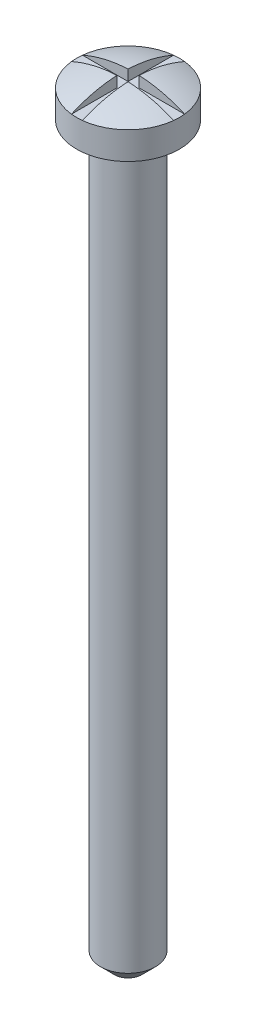
ISO-10303-21;
HEADER;
FILE_DESCRIPTION(('STEP AP214'),'2;1');
FILE_NAME('part.step','',(''),(''),'','','');
FILE_SCHEMA(('AUTOMOTIVE_DESIGN { 1 0 10303 214 1 1 1 1 }'));
ENDSEC;
DATA;
#1=APPLICATION_CONTEXT('core data for automotive mechanical design processes');
#2=APPLICATION_PROTOCOL_DEFINITION('international standard','automotive_design',2000,#1);
#3=PRODUCT_CONTEXT('',#1,'mechanical');
#4=PRODUCT('Part','Part','',(#3));
#5=PRODUCT_RELATED_PRODUCT_CATEGORY('part','',(#4));
#6=PRODUCT_DEFINITION_FORMATION('','',#4);
#7=PRODUCT_DEFINITION_CONTEXT('part definition',#1,'design');
#8=PRODUCT_DEFINITION('design','',#6,#7);
#9=PRODUCT_DEFINITION_SHAPE('','',#8);
#10=(LENGTH_UNIT() NAMED_UNIT(*) SI_UNIT(.MILLI.,.METRE.));
#11=(NAMED_UNIT(*) PLANE_ANGLE_UNIT() SI_UNIT($,.RADIAN.));
#12=(NAMED_UNIT(*) SI_UNIT($,.STERADIAN.) SOLID_ANGLE_UNIT());
#13=UNCERTAINTY_MEASURE_WITH_UNIT(LENGTH_MEASURE(1.E-05),#10,'distance_accuracy_value','');
#14=(GEOMETRIC_REPRESENTATION_CONTEXT(3) GLOBAL_UNCERTAINTY_ASSIGNED_CONTEXT((#13)) GLOBAL_UNIT_ASSIGNED_CONTEXT((#10,
#11,#12)) REPRESENTATION_CONTEXT('',''));
#15=CARTESIAN_POINT('',(0.,0.,0.));
#16=DIRECTION('',(0.,0.,1.));
#17=DIRECTION('',(1.,0.,0.));
#18=AXIS2_PLACEMENT_3D('',#15,#16,#17);
#19=CARTESIAN_POINT('',(0.,35.2666666666666,0.));
#20=DIRECTION('',(0.,-1.,0.));
#21=DIRECTION('',(-1.,0.,0.));
#22=AXIS2_PLACEMENT_3D('',#19,#20,#21);
#23=SPHERICAL_SURFACE('',#22,6.83333333333337);
#24=CARTESIAN_POINT('',(-0.300000000000007,35.2666666666666,0.));
#25=DIRECTION('',(1.,0.,0.));
#26=DIRECTION('',(0.,1.,0.));
#27=AXIS2_PLACEMENT_3D('',#24,#25,#26);
#28=CIRCLE('',#27,6.82674479121968);
#29=CARTESIAN_POINT('',(-0.300000000000008,42.086816550976,0.3));
#30=VERTEX_POINT('',#29);
#31=CARTESIAN_POINT('',(-0.300000000000008,41.5,2.783882181415));
#32=VERTEX_POINT('',#31);
#33=EDGE_CURVE('E104',#30,#32,#28,.T.);
#34=ORIENTED_EDGE('',*,*,#33,.F.);
#35=CARTESIAN_POINT('',(0.,35.2666666666666,0.3));
#36=DIRECTION('',(0.,0.,1.));
#37=DIRECTION('',(1.,0.,0.));
#38=AXIS2_PLACEMENT_3D('',#35,#36,#37);
#39=CIRCLE('',#38,6.82674479121968);
#40=CARTESIAN_POINT('',(-2.78388218141501,41.5,0.3));
#41=VERTEX_POINT('',#40);
#42=EDGE_CURVE('E55',#30,#41,#39,.T.);
#43=ORIENTED_EDGE('',*,*,#42,.T.);
#44=CARTESIAN_POINT('',(0.,41.5,0.));
#45=DIRECTION('',(0.,-1.,0.));
#46=DIRECTION('',(1.,0.,0.));
#47=AXIS2_PLACEMENT_3D('',#44,#45,#46);
#48=CIRCLE('',#47,2.79999999999999);
#49=EDGE_CURVE('E160',#32,#41,#48,.T.);
#50=ORIENTED_EDGE('',*,*,#49,.F.);
#51=EDGE_LOOP('',(#34,#43,#50));
#52=FACE_BOUND('',#51,.T.);
#53=ADVANCED_FACE('F32',(#52),#23,.T.);
#54=CARTESIAN_POINT('',(0.,35.2666666666666,-0.3));
#55=DIRECTION('',(0.,0.,1.));
#56=DIRECTION('',(1.,0.,0.));
#57=AXIS2_PLACEMENT_3D('',#54,#55,#56);
#58=CIRCLE('',#57,6.82674479121968);
#59=CARTESIAN_POINT('',(-0.300000000000008,42.086816550976,-0.3));
#60=VERTEX_POINT('',#59);
#61=CARTESIAN_POINT('',(-2.78388218141501,41.5,-0.3));
#62=VERTEX_POINT('',#61);
#63=EDGE_CURVE('E173',#60,#62,#58,.T.);
#64=ORIENTED_EDGE('',*,*,#63,.F.);
#65=CARTESIAN_POINT('',(-0.300000000000007,35.2666666666666,0.));
#66=DIRECTION('',(1.,0.,0.));
#67=DIRECTION('',(0.,1.,0.));
#68=AXIS2_PLACEMENT_3D('',#65,#66,#67);
#69=CIRCLE('',#68,6.82674479121968);
#70=CARTESIAN_POINT('',(-0.300000000000008,41.5,-2.783882181415));
#71=VERTEX_POINT('',#70);
#72=EDGE_CURVE('E171',#71,#60,#69,.T.);
#73=ORIENTED_EDGE('',*,*,#72,.F.);
#74=EDGE_CURVE('E387',#62,#71,#48,.T.);
#75=ORIENTED_EDGE('',*,*,#74,.F.);
#76=EDGE_LOOP('',(#64,#73,#75));
#77=FACE_BOUND('',#76,.T.);
#78=ADVANCED_FACE('F190',(#77),#23,.T.);
#79=CARTESIAN_POINT('',(0.299999999999992,41.5,-2.783882181415));
#80=VERTEX_POINT('',#79);
#81=CARTESIAN_POINT('',(2.78388218141499,41.5,-0.3));
#82=VERTEX_POINT('',#81);
#83=EDGE_CURVE('E155',#80,#82,#48,.T.);
#84=ORIENTED_EDGE('',*,*,#83,.F.);
#85=CARTESIAN_POINT('',(0.299999999999993,35.2666666666666,0.));
#86=DIRECTION('',(1.,0.,0.));
#87=DIRECTION('',(0.,1.,0.));
#88=AXIS2_PLACEMENT_3D('',#85,#86,#87);
#89=CIRCLE('',#88,6.82674479121968);
#90=CARTESIAN_POINT('',(0.299999999999991,42.086816550976,-0.3));
#91=VERTEX_POINT('',#90);
#92=EDGE_CURVE('E168',#80,#91,#89,.T.);
#93=ORIENTED_EDGE('',*,*,#92,.T.);
#94=CARTESIAN_POINT('',(0.,35.2666666666666,-0.3));
#95=DIRECTION('',(0.,0.,1.));
#96=DIRECTION('',(1.,0.,0.));
#97=AXIS2_PLACEMENT_3D('',#94,#95,#96);
#98=CIRCLE('',#97,6.82674479121968);
#99=EDGE_CURVE('E166',#82,#91,#98,.T.);
#100=ORIENTED_EDGE('',*,*,#99,.F.);
#101=EDGE_LOOP('',(#84,#93,#100));
#102=FACE_BOUND('',#101,.T.);
#103=ADVANCED_FACE('F196',(#102),#23,.T.);
#104=CARTESIAN_POINT('',(2.78388218141499,41.5,0.3));
#105=VERTEX_POINT('',#104);
#106=CARTESIAN_POINT('',(0.299999999999992,41.5,2.783882181415));
#107=VERTEX_POINT('',#106);
#108=EDGE_CURVE('E156',#105,#107,#48,.T.);
#109=ORIENTED_EDGE('',*,*,#108,.F.);
#110=CARTESIAN_POINT('',(0.,35.2666666666666,0.3));
#111=DIRECTION('',(0.,0.,1.));
#112=DIRECTION('',(1.,0.,0.));
#113=AXIS2_PLACEMENT_3D('',#110,#111,#112);
#114=CIRCLE('',#113,6.82674479121968);
#115=CARTESIAN_POINT('',(0.299999999999991,42.086816550976,0.3));
#116=VERTEX_POINT('',#115);
#117=EDGE_CURVE('E163',#105,#116,#114,.T.);
#118=ORIENTED_EDGE('',*,*,#117,.T.);
#119=CARTESIAN_POINT('',(0.299999999999993,35.2666666666666,0.));
#120=DIRECTION('',(1.,0.,0.));
#121=DIRECTION('',(0.,1.,0.));
#122=AXIS2_PLACEMENT_3D('',#119,#120,#121);
#123=CIRCLE('',#122,6.82674479121968);
#124=EDGE_CURVE('E159',#116,#107,#123,.T.);
#125=ORIENTED_EDGE('',*,*,#124,.T.);
#126=EDGE_LOOP('',(#109,#118,#125));
#127=FACE_BOUND('',#126,.T.);
#128=ADVANCED_FACE('F192',(#127),#23,.T.);
#129=CARTESIAN_POINT('',(0.,0.,0.));
#130=DIRECTION('',(0.,-1.,0.));
#131=DIRECTION('',(1.,0.,0.));
#132=AXIS2_PLACEMENT_3D('',#129,#130,#131);
#133=CYLINDRICAL_SURFACE('',#132,2.79999999999999);
#134=CARTESIAN_POINT('',(0.,40.,0.));
#135=DIRECTION('',(0.,-1.,0.));
#136=DIRECTION('',(1.,0.,0.));
#137=AXIS2_PLACEMENT_3D('',#134,#135,#136);
#138=CIRCLE('',#137,2.79999999999999);
#139=CARTESIAN_POINT('',(2.79999999999998,40.,0.));
#140=VERTEX_POINT('',#139);
#141=EDGE_CURVE('E152',#140,#140,#138,.T.);
#142=ORIENTED_EDGE('',*,*,#141,.F.);
#143=EDGE_LOOP('',(#142));
#144=FACE_BOUND('',#143,.T.);
#145=ORIENTED_EDGE('',*,*,#108,.T.);
#146=CARTESIAN_POINT('',(0.,41.5,0.));
#147=DIRECTION('',(0.,-1.,0.));
#148=DIRECTION('',(0.,0.,-1.));
#149=AXIS2_PLACEMENT_3D('',#146,#147,#148);
#150=CIRCLE('',#149,2.79999999999999);
#151=EDGE_CURVE('E139',#107,#32,#150,.T.);
#152=ORIENTED_EDGE('',*,*,#151,.T.);
#153=ORIENTED_EDGE('',*,*,#49,.T.);
#154=CARTESIAN_POINT('',(0.,41.5,0.));
#155=DIRECTION('',(0.,-1.,0.));
#156=DIRECTION('',(0.,0.,-1.));
#157=AXIS2_PLACEMENT_3D('',#154,#155,#156);
#158=CIRCLE('',#157,2.79999999999999);
#159=EDGE_CURVE('E116',#41,#62,#158,.T.);
#160=ORIENTED_EDGE('',*,*,#159,.T.);
#161=ORIENTED_EDGE('',*,*,#74,.T.);
#162=CARTESIAN_POINT('',(0.,41.5,0.));
#163=DIRECTION('',(0.,-1.,0.));
#164=DIRECTION('',(0.,0.,-1.));
#165=AXIS2_PLACEMENT_3D('',#162,#163,#164);
#166=CIRCLE('',#165,2.79999999999999);
#167=EDGE_CURVE('E124',#71,#80,#166,.T.);
#168=ORIENTED_EDGE('',*,*,#167,.T.);
#169=ORIENTED_EDGE('',*,*,#83,.T.);
#170=CARTESIAN_POINT('',(0.,41.5,0.));
#171=DIRECTION('',(0.,-1.,0.));
#172=DIRECTION('',(0.,0.,-1.));
#173=AXIS2_PLACEMENT_3D('',#170,#171,#172);
#174=CIRCLE('',#173,2.79999999999999);
#175=EDGE_CURVE('E130',#82,#105,#174,.T.);
#176=ORIENTED_EDGE('',*,*,#175,.T.);
#177=EDGE_LOOP('',(#145,#152,#153,#160,#161,#168,#169,#176));
#178=FACE_BOUND('',#177,.T.);
#179=ADVANCED_FACE('F200',(#144,#178),#133,.T.);
#180=CARTESIAN_POINT('',(-1.5,40.,0.));
#181=DIRECTION('',(0.,1.,0.));
#182=DIRECTION('',(-1.,0.,0.));
#183=AXIS2_PLACEMENT_3D('',#180,#181,#182);
#184=PLANE('',#183);
#185=CARTESIAN_POINT('',(0.,40.,0.));
#186=DIRECTION('',(0.,-1.,0.));
#187=DIRECTION('',(1.,0.,0.));
#188=AXIS2_PLACEMENT_3D('',#185,#186,#187);
#189=CIRCLE('',#188,1.49999999999999);
#190=CARTESIAN_POINT('',(1.49999999999998,40.,0.));
#191=VERTEX_POINT('',#190);
#192=EDGE_CURVE('E110',#191,#191,#189,.T.);
#193=ORIENTED_EDGE('',*,*,#192,.F.);
#194=EDGE_LOOP('',(#193));
#195=FACE_BOUND('',#194,.T.);
#196=ORIENTED_EDGE('',*,*,#141,.T.);
#197=EDGE_LOOP('',(#196));
#198=FACE_BOUND('',#197,.T.);
#199=ADVANCED_FACE('F206',(#195,#198),#184,.F.);
#200=CARTESIAN_POINT('',(0.,0.,0.));
#201=DIRECTION('',(0.,-1.,0.));
#202=DIRECTION('',(1.,0.,0.));
#203=AXIS2_PLACEMENT_3D('',#200,#201,#202);
#204=CYLINDRICAL_SURFACE('',#203,1.5);
#205=CARTESIAN_POINT('',(0.,0.750000000000011,0.));
#206=DIRECTION('',(0.,1.,0.));
#207=DIRECTION('',(-1.,0.,0.));
#208=AXIS2_PLACEMENT_3D('',#205,#206,#207);
#209=CIRCLE('',#208,1.5);
#210=CARTESIAN_POINT('',(-1.5,0.75000000000001,0.));
#211=VERTEX_POINT('',#210);
#212=EDGE_CURVE('E11',#211,#211,#209,.T.);
#213=ORIENTED_EDGE('',*,*,#212,.T.);
#214=EDGE_LOOP('',(#213));
#215=FACE_BOUND('',#214,.T.);
#216=ORIENTED_EDGE('',*,*,#192,.T.);
#217=EDGE_LOOP('',(#216));
#218=FACE_BOUND('',#217,.T.);
#219=ADVANCED_FACE('F244',(#215,#218),#204,.T.);
#220=CARTESIAN_POINT('',(0.,0.,0.));
#221=DIRECTION('',(0.,1.,0.));
#222=DIRECTION('',(-1.,0.,0.));
#223=AXIS2_PLACEMENT_3D('',#220,#221,#222);
#224=PLANE('',#223);
#225=CARTESIAN_POINT('',(0.,0.,0.));
#226=DIRECTION('',(0.,1.,0.));
#227=DIRECTION('',(-1.,0.,0.));
#228=AXIS2_PLACEMENT_3D('',#225,#226,#227);
#229=CIRCLE('',#228,0.749999999999987);
#230=CARTESIAN_POINT('',(-0.749999999999987,0.,0.));
#231=VERTEX_POINT('',#230);
#232=EDGE_CURVE('E40',#231,#231,#229,.F.);
#233=ORIENTED_EDGE('',*,*,#232,.T.);
#234=EDGE_LOOP('',(#233));
#235=FACE_BOUND('',#234,.T.);
#236=ADVANCED_FACE('F179',(#235),#224,.F.);
#237=CARTESIAN_POINT('',(-0.300000000000008,41.5,0.));
#238=DIRECTION('',(1.,0.,0.));
#239=DIRECTION('',(0.,1.,0.));
#240=AXIS2_PLACEMENT_3D('',#237,#238,#239);
#241=PLANE('',#240);
#242=ORIENTED_EDGE('',*,*,#33,.T.);
#243=DIRECTION('',(0.,0.,-1.));
#244=VECTOR('',#243,1.);
#245=CARTESIAN_POINT('',(-0.300000000000008,41.5,0.));
#246=LINE('',#245,#244);
#247=CARTESIAN_POINT('',(-0.300000000000008,41.5,0.3));
#248=VERTEX_POINT('',#247);
#249=EDGE_CURVE('E100',#32,#248,#246,.T.);
#250=ORIENTED_EDGE('',*,*,#249,.T.);
#251=DIRECTION('',(0.,1.,0.));
#252=VECTOR('',#251,1.);
#253=CARTESIAN_POINT('',(-0.300000000000008,41.5,0.3));
#254=LINE('',#253,#252);
#255=EDGE_CURVE('E102',#248,#30,#254,.T.);
#256=ORIENTED_EDGE('',*,*,#255,.T.);
#257=EDGE_LOOP('',(#242,#250,#256));
#258=FACE_BOUND('',#257,.T.);
#259=ADVANCED_FACE('F101',(#258),#241,.T.);
#260=CARTESIAN_POINT('',(0.,41.5,0.3));
#261=DIRECTION('',(0.,0.,1.));
#262=DIRECTION('',(1.,0.,0.));
#263=AXIS2_PLACEMENT_3D('',#260,#261,#262);
#264=PLANE('',#263);
#265=ORIENTED_EDGE('',*,*,#255,.F.);
#266=DIRECTION('',(1.,0.,0.));
#267=VECTOR('',#266,1.);
#268=CARTESIAN_POINT('',(0.,41.5,0.3));
#269=LINE('',#268,#267);
#270=EDGE_CURVE('E107',#41,#248,#269,.T.);
#271=ORIENTED_EDGE('',*,*,#270,.F.);
#272=ORIENTED_EDGE('',*,*,#42,.F.);
#273=EDGE_LOOP('',(#265,#271,#272));
#274=FACE_BOUND('',#273,.T.);
#275=ADVANCED_FACE('F109',(#274),#264,.F.);
#276=CARTESIAN_POINT('',(0.,41.5,-0.3));
#277=DIRECTION('',(0.,0.,1.));
#278=DIRECTION('',(1.,0.,0.));
#279=AXIS2_PLACEMENT_3D('',#276,#277,#278);
#280=PLANE('',#279);
#281=ORIENTED_EDGE('',*,*,#63,.T.);
#282=DIRECTION('',(1.,0.,0.));
#283=VECTOR('',#282,1.);
#284=CARTESIAN_POINT('',(0.,41.5,-0.3));
#285=LINE('',#284,#283);
#286=CARTESIAN_POINT('',(-0.300000000000008,41.5,-0.3));
#287=VERTEX_POINT('',#286);
#288=EDGE_CURVE('E118',#62,#287,#285,.T.);
#289=ORIENTED_EDGE('',*,*,#288,.T.);
#290=DIRECTION('',(0.,1.,0.));
#291=VECTOR('',#290,1.);
#292=CARTESIAN_POINT('',(-0.300000000000008,41.5,-0.3));
#293=LINE('',#292,#291);
#294=EDGE_CURVE('E111',#287,#60,#293,.T.);
#295=ORIENTED_EDGE('',*,*,#294,.T.);
#296=EDGE_LOOP('',(#281,#289,#295));
#297=FACE_BOUND('',#296,.T.);
#298=ADVANCED_FACE('F230',(#297),#280,.T.);
#299=CARTESIAN_POINT('',(-0.300000000000008,41.5,0.));
#300=DIRECTION('',(1.,0.,0.));
#301=DIRECTION('',(0.,1.,0.));
#302=AXIS2_PLACEMENT_3D('',#299,#300,#301);
#303=PLANE('',#302);
#304=ORIENTED_EDGE('',*,*,#72,.T.);
#305=ORIENTED_EDGE('',*,*,#294,.F.);
#306=DIRECTION('',(0.,0.,-1.));
#307=VECTOR('',#306,1.);
#308=CARTESIAN_POINT('',(-0.300000000000008,41.5,0.));
#309=LINE('',#308,#307);
#310=EDGE_CURVE('E122',#287,#71,#309,.T.);
#311=ORIENTED_EDGE('',*,*,#310,.T.);
#312=EDGE_LOOP('',(#304,#305,#311));
#313=FACE_BOUND('',#312,.T.);
#314=ADVANCED_FACE('F222',(#313),#303,.T.);
#315=CARTESIAN_POINT('',(0.299999999999992,41.5,0.));
#316=DIRECTION('',(1.,0.,0.));
#317=DIRECTION('',(0.,1.,0.));
#318=AXIS2_PLACEMENT_3D('',#315,#316,#317);
#319=PLANE('',#318);
#320=DIRECTION('',(0.,0.,-1.));
#321=VECTOR('',#320,1.);
#322=CARTESIAN_POINT('',(0.299999999999992,41.5,0.));
#323=LINE('',#322,#321);
#324=CARTESIAN_POINT('',(0.299999999999992,41.5,-0.3));
#325=VERTEX_POINT('',#324);
#326=EDGE_CURVE('E47',#325,#80,#323,.T.);
#327=ORIENTED_EDGE('',*,*,#326,.F.);
#328=DIRECTION('',(0.,1.,0.));
#329=VECTOR('',#328,1.);
#330=CARTESIAN_POINT('',(0.299999999999992,41.5,-0.3));
#331=LINE('',#330,#329);
#332=EDGE_CURVE('E145',#325,#91,#331,.T.);
#333=ORIENTED_EDGE('',*,*,#332,.T.);
#334=ORIENTED_EDGE('',*,*,#92,.F.);
#335=EDGE_LOOP('',(#327,#333,#334));
#336=FACE_BOUND('',#335,.T.);
#337=ADVANCED_FACE('F220',(#336),#319,.F.);
#338=CARTESIAN_POINT('',(0.,41.5,-0.3));
#339=DIRECTION('',(0.,0.,1.));
#340=DIRECTION('',(1.,0.,0.));
#341=AXIS2_PLACEMENT_3D('',#338,#339,#340);
#342=PLANE('',#341);
#343=ORIENTED_EDGE('',*,*,#99,.T.);
#344=ORIENTED_EDGE('',*,*,#332,.F.);
#345=DIRECTION('',(1.,0.,0.));
#346=VECTOR('',#345,1.);
#347=CARTESIAN_POINT('',(0.,41.5,-0.3));
#348=LINE('',#347,#346);
#349=EDGE_CURVE('E128',#325,#82,#348,.T.);
#350=ORIENTED_EDGE('',*,*,#349,.T.);
#351=EDGE_LOOP('',(#343,#344,#350));
#352=FACE_BOUND('',#351,.T.);
#353=ADVANCED_FACE('F218',(#352),#342,.T.);
#354=CARTESIAN_POINT('',(0.,41.5,0.3));
#355=DIRECTION('',(0.,0.,1.));
#356=DIRECTION('',(1.,0.,0.));
#357=AXIS2_PLACEMENT_3D('',#354,#355,#356);
#358=PLANE('',#357);
#359=DIRECTION('',(1.,0.,0.));
#360=VECTOR('',#359,1.);
#361=CARTESIAN_POINT('',(0.,41.5,0.3));
#362=LINE('',#361,#360);
#363=CARTESIAN_POINT('',(0.299999999999992,41.5,0.3));
#364=VERTEX_POINT('',#363);
#365=EDGE_CURVE('E133',#364,#105,#362,.T.);
#366=ORIENTED_EDGE('',*,*,#365,.F.);
#367=DIRECTION('',(0.,1.,0.));
#368=VECTOR('',#367,1.);
#369=CARTESIAN_POINT('',(0.299999999999992,41.5,0.3));
#370=LINE('',#369,#368);
#371=EDGE_CURVE('E142',#364,#116,#370,.T.);
#372=ORIENTED_EDGE('',*,*,#371,.T.);
#373=ORIENTED_EDGE('',*,*,#117,.F.);
#374=EDGE_LOOP('',(#366,#372,#373));
#375=FACE_BOUND('',#374,.T.);
#376=ADVANCED_FACE('F228',(#375),#358,.F.);
#377=CARTESIAN_POINT('',(0.299999999999992,41.5,0.));
#378=DIRECTION('',(1.,0.,0.));
#379=DIRECTION('',(0.,1.,0.));
#380=AXIS2_PLACEMENT_3D('',#377,#378,#379);
#381=PLANE('',#380);
#382=ORIENTED_EDGE('',*,*,#371,.F.);
#383=DIRECTION('',(0.,0.,-1.));
#384=VECTOR('',#383,1.);
#385=CARTESIAN_POINT('',(0.299999999999992,41.5,0.));
#386=LINE('',#385,#384);
#387=EDGE_CURVE('E136',#107,#364,#386,.T.);
#388=ORIENTED_EDGE('',*,*,#387,.F.);
#389=ORIENTED_EDGE('',*,*,#124,.F.);
#390=EDGE_LOOP('',(#382,#388,#389));
#391=FACE_BOUND('',#390,.T.);
#392=ADVANCED_FACE('F186',(#391),#381,.F.);
#393=CARTESIAN_POINT('',(0.,41.5,0.));
#394=DIRECTION('',(0.,-1.,0.));
#395=DIRECTION('',(0.,0.,-1.));
#396=AXIS2_PLACEMENT_3D('',#393,#394,#395);
#397=PLANE('',#396);
#398=ORIENTED_EDGE('',*,*,#249,.F.);
#399=ORIENTED_EDGE('',*,*,#151,.F.);
#400=ORIENTED_EDGE('',*,*,#387,.T.);
#401=ORIENTED_EDGE('',*,*,#365,.T.);
#402=ORIENTED_EDGE('',*,*,#175,.F.);
#403=ORIENTED_EDGE('',*,*,#349,.F.);
#404=ORIENTED_EDGE('',*,*,#326,.T.);
#405=ORIENTED_EDGE('',*,*,#167,.F.);
#406=ORIENTED_EDGE('',*,*,#310,.F.);
#407=ORIENTED_EDGE('',*,*,#288,.F.);
#408=ORIENTED_EDGE('',*,*,#159,.F.);
#409=ORIENTED_EDGE('',*,*,#270,.T.);
#410=EDGE_LOOP('',(#398,#399,#400,#401,#402,#403,#404,#405,#406,#407,#408,#409));
#411=FACE_BOUND('',#410,.T.);
#412=ADVANCED_FACE('F113',(#411),#397,.F.);
#413=CARTESIAN_POINT('',(0.,0.,0.));
#414=DIRECTION('',(0.,1.,0.));
#415=DIRECTION('',(-1.,0.,0.));
#416=AXIS2_PLACEMENT_3D('',#413,#414,#415);
#417=CONICAL_SURFACE('',#416,0.749999999999987,0.785398163397447);
#418=ORIENTED_EDGE('',*,*,#212,.F.);
#419=EDGE_LOOP('',(#418));
#420=FACE_BOUND('',#419,.T.);
#421=ORIENTED_EDGE('',*,*,#232,.F.);
#422=EDGE_LOOP('',(#421));
#423=FACE_BOUND('',#422,.T.);
#424=ADVANCED_FACE('F34',(#420,#423),#417,.T.);
#425=CLOSED_SHELL('',(#53,#78,#103,#128,#179,#199,#219,#236,#259,#275,#298,#314,#337,#353,#376,
#392,#412,#424));
#426=MANIFOLD_SOLID_BREP('B2',#425);
#427=ADVANCED_BREP_SHAPE_REPRESENTATION('',(#18,#426),#14);
#428=SHAPE_DEFINITION_REPRESENTATION(#9,#427);
ENDSEC;
END-ISO-10303-21;
